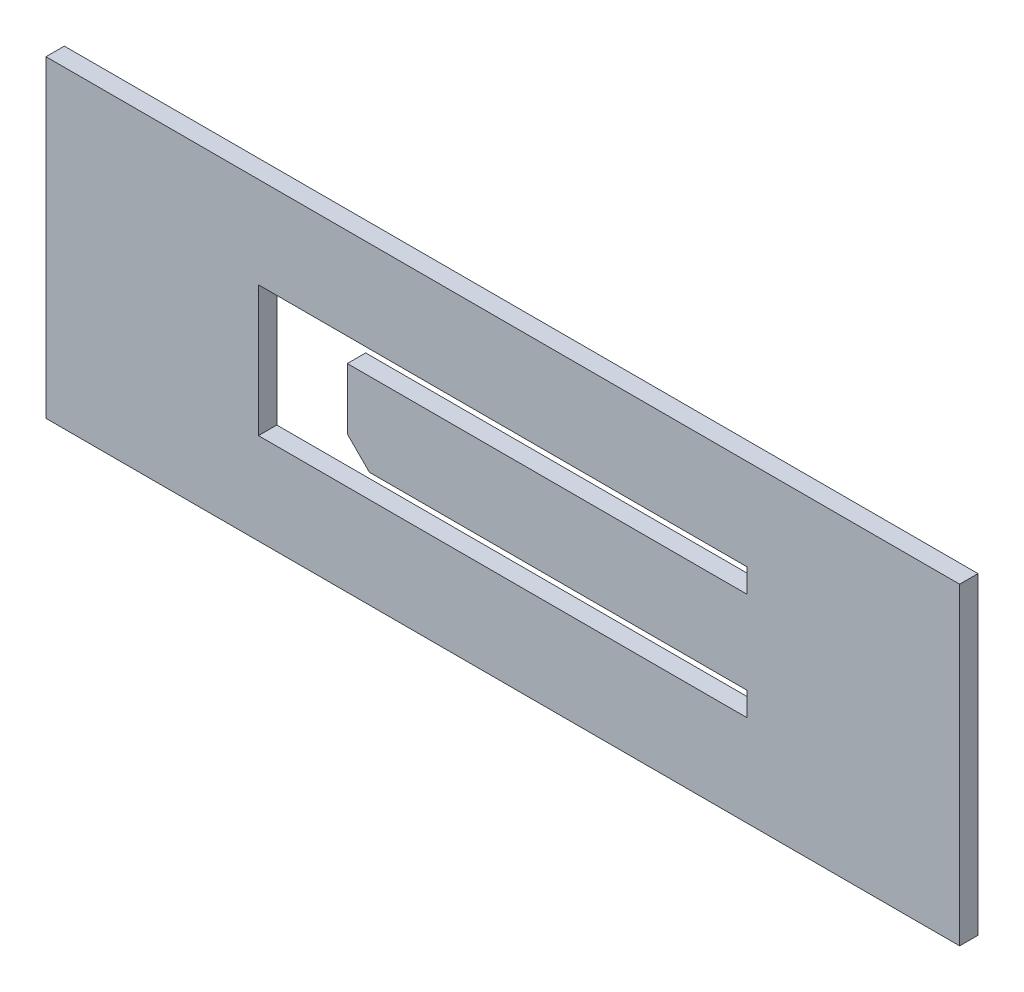
ISO-10303-21;
HEADER;
FILE_DESCRIPTION(('STEP AP214'),'2;1');
FILE_NAME('part.step','',(''),(''),'','','');
FILE_SCHEMA(('AUTOMOTIVE_DESIGN { 1 0 10303 214 1 1 1 1 }'));
ENDSEC;
DATA;
#1=APPLICATION_CONTEXT('core data for automotive mechanical design processes');
#2=APPLICATION_PROTOCOL_DEFINITION('international standard','automotive_design',2000,#1);
#3=PRODUCT_CONTEXT('',#1,'mechanical');
#4=PRODUCT('Part','Part','',(#3));
#5=PRODUCT_RELATED_PRODUCT_CATEGORY('part','',(#4));
#6=PRODUCT_DEFINITION_FORMATION('','',#4);
#7=PRODUCT_DEFINITION_CONTEXT('part definition',#1,'design');
#8=PRODUCT_DEFINITION('design','',#6,#7);
#9=PRODUCT_DEFINITION_SHAPE('','',#8);
#10=(LENGTH_UNIT() NAMED_UNIT(*) SI_UNIT(.MILLI.,.METRE.));
#11=(NAMED_UNIT(*) PLANE_ANGLE_UNIT() SI_UNIT($,.RADIAN.));
#12=(NAMED_UNIT(*) SI_UNIT($,.STERADIAN.) SOLID_ANGLE_UNIT());
#13=UNCERTAINTY_MEASURE_WITH_UNIT(LENGTH_MEASURE(1.E-05),#10,'distance_accuracy_value','');
#14=(GEOMETRIC_REPRESENTATION_CONTEXT(3) GLOBAL_UNCERTAINTY_ASSIGNED_CONTEXT((#13)) GLOBAL_UNIT_ASSIGNED_CONTEXT((#10,
#11,#12)) REPRESENTATION_CONTEXT('',''));
#15=CARTESIAN_POINT('',(0.,0.,0.));
#16=DIRECTION('',(0.,0.,1.));
#17=DIRECTION('',(1.,0.,0.));
#18=AXIS2_PLACEMENT_3D('',#15,#16,#17);
#19=CARTESIAN_POINT('',(74.6378493013972,-25.590119760479,-3.));
#20=DIRECTION('',(1.,0.,0.));
#21=DIRECTION('',(0.,0.,-1.));
#22=AXIS2_PLACEMENT_3D('',#19,#20,#21);
#23=PLANE('',#22);
#24=DIRECTION('',(0.,1.,0.));
#25=VECTOR('',#24,1.);
#26=CARTESIAN_POINT('',(74.6378493013972,-25.590119760479,0.));
#27=LINE('',#26,#25);
#28=CARTESIAN_POINT('',(74.6378493013972,-25.590119760479,0.));
#29=VERTEX_POINT('',#28);
#30=CARTESIAN_POINT('',(74.6378493013972,25.590119760479,0.));
#31=VERTEX_POINT('',#30);
#32=EDGE_CURVE('E196',#29,#31,#27,.T.);
#33=ORIENTED_EDGE('',*,*,#32,.F.);
#34=DIRECTION('',(0.,0.,1.));
#35=VECTOR('',#34,1.);
#36=CARTESIAN_POINT('',(74.6378493013972,-25.590119760479,-3.));
#37=LINE('',#36,#35);
#38=CARTESIAN_POINT('',(74.6378493013972,-25.590119760479,-3.));
#39=VERTEX_POINT('',#38);
#40=EDGE_CURVE('E11',#39,#29,#37,.T.);
#41=ORIENTED_EDGE('',*,*,#40,.F.);
#42=DIRECTION('',(0.,1.,0.));
#43=VECTOR('',#42,1.);
#44=CARTESIAN_POINT('',(74.6378493013972,-25.590119760479,-3.));
#45=LINE('',#44,#43);
#46=CARTESIAN_POINT('',(74.6378493013972,25.590119760479,-3.));
#47=VERTEX_POINT('',#46);
#48=EDGE_CURVE('E210',#39,#47,#45,.T.);
#49=ORIENTED_EDGE('',*,*,#48,.T.);
#50=DIRECTION('',(0.,0.,1.));
#51=VECTOR('',#50,1.);
#52=CARTESIAN_POINT('',(74.6378493013972,25.590119760479,-3.));
#53=LINE('',#52,#51);
#54=EDGE_CURVE('E41',#47,#31,#53,.T.);
#55=ORIENTED_EDGE('',*,*,#54,.T.);
#56=EDGE_LOOP('',(#33,#41,#49,#55));
#57=FACE_BOUND('',#56,.T.);
#58=ADVANCED_FACE('F38',(#57),#23,.T.);
#59=CARTESIAN_POINT('',(74.6378493013972,-25.590119760479,-3.));
#60=DIRECTION('',(0.,-1.,0.));
#61=DIRECTION('',(0.,0.,-1.));
#62=AXIS2_PLACEMENT_3D('',#59,#60,#61);
#63=PLANE('',#62);
#64=DIRECTION('',(1.,0.,0.));
#65=VECTOR('',#64,1.);
#66=CARTESIAN_POINT('',(74.6378493013972,-25.590119760479,0.));
#67=LINE('',#66,#65);
#68=CARTESIAN_POINT('',(-74.6378493013972,-25.590119760479,0.));
#69=VERTEX_POINT('',#68);
#70=EDGE_CURVE('E214',#69,#29,#67,.T.);
#71=ORIENTED_EDGE('',*,*,#70,.F.);
#72=DIRECTION('',(0.,0.,1.));
#73=VECTOR('',#72,1.);
#74=CARTESIAN_POINT('',(-74.6378493013972,-25.590119760479,-3.));
#75=LINE('',#74,#73);
#76=CARTESIAN_POINT('',(-74.6378493013972,-25.590119760479,-3.));
#77=VERTEX_POINT('',#76);
#78=EDGE_CURVE('E46',#77,#69,#75,.T.);
#79=ORIENTED_EDGE('',*,*,#78,.F.);
#80=DIRECTION('',(1.,0.,0.));
#81=VECTOR('',#80,1.);
#82=CARTESIAN_POINT('',(74.6378493013972,-25.590119760479,-3.));
#83=LINE('',#82,#81);
#84=EDGE_CURVE('E220',#77,#39,#83,.T.);
#85=ORIENTED_EDGE('',*,*,#84,.T.);
#86=ORIENTED_EDGE('',*,*,#40,.T.);
#87=EDGE_LOOP('',(#71,#79,#85,#86));
#88=FACE_BOUND('',#87,.T.);
#89=ADVANCED_FACE('F246',(#88),#63,.T.);
#90=CARTESIAN_POINT('',(-74.6378493013972,-25.590119760479,-3.));
#91=DIRECTION('',(-1.,0.,0.));
#92=DIRECTION('',(0.,0.,1.));
#93=AXIS2_PLACEMENT_3D('',#90,#91,#92);
#94=PLANE('',#93);
#95=DIRECTION('',(0.,-1.,0.));
#96=VECTOR('',#95,1.);
#97=CARTESIAN_POINT('',(-74.6378493013972,-25.590119760479,0.));
#98=LINE('',#97,#96);
#99=CARTESIAN_POINT('',(-74.6378493013972,25.590119760479,0.));
#100=VERTEX_POINT('',#99);
#101=EDGE_CURVE('E228',#100,#69,#98,.T.);
#102=ORIENTED_EDGE('',*,*,#101,.F.);
#103=DIRECTION('',(0.,0.,1.));
#104=VECTOR('',#103,1.);
#105=CARTESIAN_POINT('',(-74.6378493013972,25.590119760479,-3.));
#106=LINE('',#105,#104);
#107=CARTESIAN_POINT('',(-74.6378493013972,25.590119760479,-3.));
#108=VERTEX_POINT('',#107);
#109=EDGE_CURVE('E233',#108,#100,#106,.T.);
#110=ORIENTED_EDGE('',*,*,#109,.F.);
#111=DIRECTION('',(0.,-1.,0.));
#112=VECTOR('',#111,1.);
#113=CARTESIAN_POINT('',(-74.6378493013972,-25.590119760479,-3.));
#114=LINE('',#113,#112);
#115=EDGE_CURVE('E217',#108,#77,#114,.T.);
#116=ORIENTED_EDGE('',*,*,#115,.T.);
#117=ORIENTED_EDGE('',*,*,#78,.T.);
#118=EDGE_LOOP('',(#102,#110,#116,#117));
#119=FACE_BOUND('',#118,.T.);
#120=ADVANCED_FACE('F250',(#119),#94,.T.);
#121=CARTESIAN_POINT('',(74.6378493013972,25.590119760479,-3.));
#122=DIRECTION('',(0.,1.,0.));
#123=DIRECTION('',(0.,0.,1.));
#124=AXIS2_PLACEMENT_3D('',#121,#122,#123);
#125=PLANE('',#124);
#126=DIRECTION('',(-1.,0.,0.));
#127=VECTOR('',#126,1.);
#128=CARTESIAN_POINT('',(74.6378493013972,25.590119760479,0.));
#129=LINE('',#128,#127);
#130=EDGE_CURVE('E225',#31,#100,#129,.T.);
#131=ORIENTED_EDGE('',*,*,#130,.F.);
#132=ORIENTED_EDGE('',*,*,#54,.F.);
#133=DIRECTION('',(-1.,0.,0.));
#134=VECTOR('',#133,1.);
#135=CARTESIAN_POINT('',(74.6378493013972,25.590119760479,-3.));
#136=LINE('',#135,#134);
#137=EDGE_CURVE('E213',#47,#108,#136,.T.);
#138=ORIENTED_EDGE('',*,*,#137,.T.);
#139=ORIENTED_EDGE('',*,*,#109,.T.);
#140=EDGE_LOOP('',(#131,#132,#138,#139));
#141=FACE_BOUND('',#140,.T.);
#142=ADVANCED_FACE('F241',(#141),#125,.T.);
#143=CARTESIAN_POINT('',(0.,0.,-3.));
#144=DIRECTION('',(0.,0.,1.));
#145=DIRECTION('',(1.,0.,0.));
#146=AXIS2_PLACEMENT_3D('',#143,#144,#145);
#147=PLANE('',#146);
#148=DIRECTION('',(0.,1.,0.));
#149=VECTOR('',#148,1.);
#150=CARTESIAN_POINT('',(-25.4100806282466,6.79196508268889,-3.));
#151=LINE('',#150,#149);
#152=CARTESIAN_POINT('',(-25.4100806282466,-3.17731175601577,-3.));
#153=VERTEX_POINT('',#152);
#154=CARTESIAN_POINT('',(-25.4100806282466,6.79196508268889,-3.));
#155=VERTEX_POINT('',#154);
#156=EDGE_CURVE('E141',#153,#155,#151,.T.);
#157=ORIENTED_EDGE('',*,*,#156,.T.);
#158=DIRECTION('',(1.,0.,0.));
#159=VECTOR('',#158,1.);
#160=CARTESIAN_POINT('',(39.9264512287923,6.79196508268892,-3.));
#161=LINE('',#160,#159);
#162=CARTESIAN_POINT('',(39.9264512287923,6.79196508268892,-3.));
#163=VERTEX_POINT('',#162);
#164=EDGE_CURVE('E135',#155,#163,#161,.T.);
#165=ORIENTED_EDGE('',*,*,#164,.T.);
#166=DIRECTION('',(0.,1.,0.));
#167=VECTOR('',#166,1.);
#168=CARTESIAN_POINT('',(39.9264512287923,6.79196508268892,-3.));
#169=LINE('',#168,#167);
#170=CARTESIAN_POINT('',(39.9264512287924,10.6721055548399,-3.));
#171=VERTEX_POINT('',#170);
#172=EDGE_CURVE('E144',#163,#171,#169,.T.);
#173=ORIENTED_EDGE('',*,*,#172,.T.);
#174=DIRECTION('',(-1.,0.,0.));
#175=VECTOR('',#174,1.);
#176=CARTESIAN_POINT('',(39.9264512287924,10.6721055548399,-3.));
#177=LINE('',#176,#175);
#178=CARTESIAN_POINT('',(-39.9264512287924,10.6721055548399,-3.));
#179=VERTEX_POINT('',#178);
#180=EDGE_CURVE('E54',#171,#179,#177,.T.);
#181=ORIENTED_EDGE('',*,*,#180,.T.);
#182=DIRECTION('',(0.,-1.,0.));
#183=VECTOR('',#182,1.);
#184=CARTESIAN_POINT('',(-39.9264512287924,-10.6721055548399,-3.));
#185=LINE('',#184,#183);
#186=CARTESIAN_POINT('',(-39.9264512287924,-10.6721055548399,-3.));
#187=VERTEX_POINT('',#186);
#188=EDGE_CURVE('E159',#179,#187,#185,.T.);
#189=ORIENTED_EDGE('',*,*,#188,.T.);
#190=DIRECTION('',(1.,0.,0.));
#191=VECTOR('',#190,1.);
#192=CARTESIAN_POINT('',(39.9264512287924,-10.6721055548399,-3.));
#193=LINE('',#192,#191);
#194=CARTESIAN_POINT('',(39.9264512287924,-10.6721055548399,-3.));
#195=VERTEX_POINT('',#194);
#196=EDGE_CURVE('E162',#187,#195,#193,.T.);
#197=ORIENTED_EDGE('',*,*,#196,.T.);
#198=DIRECTION('',(0.,1.,0.));
#199=VECTOR('',#198,1.);
#200=CARTESIAN_POINT('',(39.9264512287924,-10.6721055548399,-3.));
#201=LINE('',#200,#199);
#202=CARTESIAN_POINT('',(39.9264512287923,-6.79196508268892,-3.));
#203=VERTEX_POINT('',#202);
#204=EDGE_CURVE('E165',#195,#203,#201,.T.);
#205=ORIENTED_EDGE('',*,*,#204,.T.);
#206=DIRECTION('',(-1.,0.,0.));
#207=VECTOR('',#206,1.);
#208=CARTESIAN_POINT('',(39.9264512287923,-6.79196508268892,-3.));
#209=LINE('',#208,#207);
#210=CARTESIAN_POINT('',(-21.7954273015734,-6.79196508268893,-3.));
#211=VERTEX_POINT('',#210);
#212=EDGE_CURVE('E168',#203,#211,#209,.T.);
#213=ORIENTED_EDGE('',*,*,#212,.T.);
#214=DIRECTION('',(-0.707106781186558,0.707106781186537,0.));
#215=VECTOR('',#214,1.);
#216=CARTESIAN_POINT('',(-21.7954273015734,-6.79196508268893,-3.));
#217=LINE('',#216,#215);
#218=EDGE_CURVE('E171',#211,#153,#217,.T.);
#219=ORIENTED_EDGE('',*,*,#218,.T.);
#220=EDGE_LOOP('',(#157,#165,#173,#181,#189,#197,#205,#213,#219));
#221=FACE_BOUND('',#220,.T.);
#222=ORIENTED_EDGE('',*,*,#48,.F.);
#223=ORIENTED_EDGE('',*,*,#84,.F.);
#224=ORIENTED_EDGE('',*,*,#115,.F.);
#225=ORIENTED_EDGE('',*,*,#137,.F.);
#226=EDGE_LOOP('',(#222,#223,#224,#225));
#227=FACE_BOUND('',#226,.T.);
#228=ADVANCED_FACE('F148',(#221,#227),#147,.F.);
#229=CARTESIAN_POINT('',(0.,0.,0.));
#230=DIRECTION('',(0.,0.,1.));
#231=DIRECTION('',(1.,0.,0.));
#232=AXIS2_PLACEMENT_3D('',#229,#230,#231);
#233=PLANE('',#232);
#234=DIRECTION('',(1.,0.,0.));
#235=VECTOR('',#234,1.);
#236=CARTESIAN_POINT('',(39.9264512287923,6.79196508268892,0.));
#237=LINE('',#236,#235);
#238=CARTESIAN_POINT('',(-25.4100806282466,6.79196508268889,0.));
#239=VERTEX_POINT('',#238);
#240=CARTESIAN_POINT('',(39.9264512287923,6.79196508268892,0.));
#241=VERTEX_POINT('',#240);
#242=EDGE_CURVE('E62',#239,#241,#237,.T.);
#243=ORIENTED_EDGE('',*,*,#242,.F.);
#244=DIRECTION('',(0.,1.,0.));
#245=VECTOR('',#244,1.);
#246=CARTESIAN_POINT('',(-25.4100806282466,6.79196508268889,0.));
#247=LINE('',#246,#245);
#248=CARTESIAN_POINT('',(-25.4100806282466,-3.17731175601577,0.));
#249=VERTEX_POINT('',#248);
#250=EDGE_CURVE('E152',#249,#239,#247,.T.);
#251=ORIENTED_EDGE('',*,*,#250,.F.);
#252=DIRECTION('',(-0.707106781186558,0.707106781186537,0.));
#253=VECTOR('',#252,1.);
#254=CARTESIAN_POINT('',(-21.7954273015734,-6.79196508268893,0.));
#255=LINE('',#254,#253);
#256=CARTESIAN_POINT('',(-21.7954273015734,-6.79196508268893,0.));
#257=VERTEX_POINT('',#256);
#258=EDGE_CURVE('E155',#257,#249,#255,.T.);
#259=ORIENTED_EDGE('',*,*,#258,.F.);
#260=DIRECTION('',(-1.,0.,0.));
#261=VECTOR('',#260,1.);
#262=CARTESIAN_POINT('',(39.9264512287923,-6.79196508268892,0.));
#263=LINE('',#262,#261);
#264=CARTESIAN_POINT('',(39.9264512287923,-6.79196508268892,0.));
#265=VERTEX_POINT('',#264);
#266=EDGE_CURVE('E189',#265,#257,#263,.T.);
#267=ORIENTED_EDGE('',*,*,#266,.F.);
#268=DIRECTION('',(0.,1.,0.));
#269=VECTOR('',#268,1.);
#270=CARTESIAN_POINT('',(39.9264512287924,-10.6721055548399,0.));
#271=LINE('',#270,#269);
#272=CARTESIAN_POINT('',(39.9264512287924,-10.6721055548399,0.));
#273=VERTEX_POINT('',#272);
#274=EDGE_CURVE('E186',#273,#265,#271,.T.);
#275=ORIENTED_EDGE('',*,*,#274,.F.);
#276=DIRECTION('',(1.,0.,0.));
#277=VECTOR('',#276,1.);
#278=CARTESIAN_POINT('',(39.9264512287924,-10.6721055548399,0.));
#279=LINE('',#278,#277);
#280=CARTESIAN_POINT('',(-39.9264512287924,-10.6721055548399,0.));
#281=VERTEX_POINT('',#280);
#282=EDGE_CURVE('E183',#281,#273,#279,.T.);
#283=ORIENTED_EDGE('',*,*,#282,.F.);
#284=DIRECTION('',(0.,-1.,0.));
#285=VECTOR('',#284,1.);
#286=CARTESIAN_POINT('',(-39.9264512287924,-10.6721055548399,0.));
#287=LINE('',#286,#285);
#288=CARTESIAN_POINT('',(-39.9264512287924,10.6721055548399,0.));
#289=VERTEX_POINT('',#288);
#290=EDGE_CURVE('E180',#289,#281,#287,.T.);
#291=ORIENTED_EDGE('',*,*,#290,.F.);
#292=DIRECTION('',(-1.,0.,0.));
#293=VECTOR('',#292,1.);
#294=CARTESIAN_POINT('',(39.9264512287924,10.6721055548399,0.));
#295=LINE('',#294,#293);
#296=CARTESIAN_POINT('',(39.9264512287924,10.6721055548399,0.));
#297=VERTEX_POINT('',#296);
#298=EDGE_CURVE('E177',#297,#289,#295,.T.);
#299=ORIENTED_EDGE('',*,*,#298,.F.);
#300=DIRECTION('',(0.,1.,0.));
#301=VECTOR('',#300,1.);
#302=CARTESIAN_POINT('',(39.9264512287923,6.79196508268892,0.));
#303=LINE('',#302,#301);
#304=EDGE_CURVE('E175',#241,#297,#303,.T.);
#305=ORIENTED_EDGE('',*,*,#304,.F.);
#306=EDGE_LOOP('',(#243,#251,#259,#267,#275,#283,#291,#299,#305));
#307=FACE_BOUND('',#306,.T.);
#308=ORIENTED_EDGE('',*,*,#32,.T.);
#309=ORIENTED_EDGE('',*,*,#130,.T.);
#310=ORIENTED_EDGE('',*,*,#101,.T.);
#311=ORIENTED_EDGE('',*,*,#70,.T.);
#312=EDGE_LOOP('',(#308,#309,#310,#311));
#313=FACE_BOUND('',#312,.T.);
#314=ADVANCED_FACE('F243',(#307,#313),#233,.T.);
#315=CARTESIAN_POINT('',(39.9264512287923,6.79196508268892,-3.));
#316=DIRECTION('',(0.,-1.,0.));
#317=DIRECTION('',(1.,0.,0.));
#318=AXIS2_PLACEMENT_3D('',#315,#316,#317);
#319=PLANE('',#318);
#320=ORIENTED_EDGE('',*,*,#242,.T.);
#321=DIRECTION('',(0.,0.,1.));
#322=VECTOR('',#321,1.);
#323=CARTESIAN_POINT('',(39.9264512287923,6.79196508268892,-3.));
#324=LINE('',#323,#322);
#325=EDGE_CURVE('E131',#163,#241,#324,.T.);
#326=ORIENTED_EDGE('',*,*,#325,.F.);
#327=ORIENTED_EDGE('',*,*,#164,.F.);
#328=DIRECTION('',(0.,0.,1.));
#329=VECTOR('',#328,1.);
#330=CARTESIAN_POINT('',(-25.4100806282466,6.79196508268889,-3.));
#331=LINE('',#330,#329);
#332=EDGE_CURVE('E194',#155,#239,#331,.T.);
#333=ORIENTED_EDGE('',*,*,#332,.T.);
#334=EDGE_LOOP('',(#320,#326,#327,#333));
#335=FACE_BOUND('',#334,.T.);
#336=ADVANCED_FACE('F133',(#335),#319,.F.);
#337=CARTESIAN_POINT('',(-25.4100806282466,6.79196508268889,-3.));
#338=DIRECTION('',(1.,0.,0.));
#339=DIRECTION('',(0.,0.,-1.));
#340=AXIS2_PLACEMENT_3D('',#337,#338,#339);
#341=PLANE('',#340);
#342=ORIENTED_EDGE('',*,*,#250,.T.);
#343=ORIENTED_EDGE('',*,*,#332,.F.);
#344=ORIENTED_EDGE('',*,*,#156,.F.);
#345=DIRECTION('',(0.,0.,1.));
#346=VECTOR('',#345,1.);
#347=CARTESIAN_POINT('',(-25.4100806282466,-3.17731175601577,-3.));
#348=LINE('',#347,#346);
#349=EDGE_CURVE('E197',#153,#249,#348,.T.);
#350=ORIENTED_EDGE('',*,*,#349,.T.);
#351=EDGE_LOOP('',(#342,#343,#344,#350));
#352=FACE_BOUND('',#351,.T.);
#353=ADVANCED_FACE('F306',(#352),#341,.F.);
#354=CARTESIAN_POINT('',(-21.7954273015734,-6.79196508268893,-3.));
#355=DIRECTION('',(0.707106781186537,0.707106781186558,0.));
#356=DIRECTION('',(-0.707106781186558,0.707106781186537,0.));
#357=AXIS2_PLACEMENT_3D('',#354,#355,#356);
#358=PLANE('',#357);
#359=ORIENTED_EDGE('',*,*,#258,.T.);
#360=ORIENTED_EDGE('',*,*,#349,.F.);
#361=ORIENTED_EDGE('',*,*,#218,.F.);
#362=DIRECTION('',(0.,0.,1.));
#363=VECTOR('',#362,1.);
#364=CARTESIAN_POINT('',(-21.7954273015734,-6.79196508268893,-3.));
#365=LINE('',#364,#363);
#366=EDGE_CURVE('E199',#211,#257,#365,.T.);
#367=ORIENTED_EDGE('',*,*,#366,.T.);
#368=EDGE_LOOP('',(#359,#360,#361,#367));
#369=FACE_BOUND('',#368,.T.);
#370=ADVANCED_FACE('F316',(#369),#358,.F.);
#371=CARTESIAN_POINT('',(39.9264512287923,-6.79196508268892,-3.));
#372=DIRECTION('',(0.,1.,0.));
#373=DIRECTION('',(-1.,0.,0.));
#374=AXIS2_PLACEMENT_3D('',#371,#372,#373);
#375=PLANE('',#374);
#376=ORIENTED_EDGE('',*,*,#266,.T.);
#377=ORIENTED_EDGE('',*,*,#366,.F.);
#378=ORIENTED_EDGE('',*,*,#212,.F.);
#379=DIRECTION('',(0.,0.,1.));
#380=VECTOR('',#379,1.);
#381=CARTESIAN_POINT('',(39.9264512287923,-6.79196508268892,-3.));
#382=LINE('',#381,#380);
#383=EDGE_CURVE('E201',#203,#265,#382,.T.);
#384=ORIENTED_EDGE('',*,*,#383,.T.);
#385=EDGE_LOOP('',(#376,#377,#378,#384));
#386=FACE_BOUND('',#385,.T.);
#387=ADVANCED_FACE('F327',(#386),#375,.F.);
#388=CARTESIAN_POINT('',(39.9264512287924,-10.6721055548399,-3.));
#389=DIRECTION('',(1.,0.,0.));
#390=DIRECTION('',(0.,1.,0.));
#391=AXIS2_PLACEMENT_3D('',#388,#389,#390);
#392=PLANE('',#391);
#393=ORIENTED_EDGE('',*,*,#274,.T.);
#394=ORIENTED_EDGE('',*,*,#383,.F.);
#395=ORIENTED_EDGE('',*,*,#204,.F.);
#396=DIRECTION('',(0.,0.,1.));
#397=VECTOR('',#396,1.);
#398=CARTESIAN_POINT('',(39.9264512287924,-10.6721055548399,-3.));
#399=LINE('',#398,#397);
#400=EDGE_CURVE('E203',#195,#273,#399,.T.);
#401=ORIENTED_EDGE('',*,*,#400,.T.);
#402=EDGE_LOOP('',(#393,#394,#395,#401));
#403=FACE_BOUND('',#402,.T.);
#404=ADVANCED_FACE('F338',(#403),#392,.F.);
#405=CARTESIAN_POINT('',(39.9264512287924,-10.6721055548399,-3.));
#406=DIRECTION('',(0.,-1.,0.));
#407=DIRECTION('',(0.,0.,-1.));
#408=AXIS2_PLACEMENT_3D('',#405,#406,#407);
#409=PLANE('',#408);
#410=ORIENTED_EDGE('',*,*,#282,.T.);
#411=ORIENTED_EDGE('',*,*,#400,.F.);
#412=ORIENTED_EDGE('',*,*,#196,.F.);
#413=DIRECTION('',(0.,0.,1.));
#414=VECTOR('',#413,1.);
#415=CARTESIAN_POINT('',(-39.9264512287924,-10.6721055548399,-3.));
#416=LINE('',#415,#414);
#417=EDGE_CURVE('E205',#187,#281,#416,.T.);
#418=ORIENTED_EDGE('',*,*,#417,.T.);
#419=EDGE_LOOP('',(#410,#411,#412,#418));
#420=FACE_BOUND('',#419,.T.);
#421=ADVANCED_FACE('F349',(#420),#409,.F.);
#422=CARTESIAN_POINT('',(-39.9264512287924,-10.6721055548399,-3.));
#423=DIRECTION('',(-1.,0.,0.));
#424=DIRECTION('',(0.,0.,1.));
#425=AXIS2_PLACEMENT_3D('',#422,#423,#424);
#426=PLANE('',#425);
#427=ORIENTED_EDGE('',*,*,#290,.T.);
#428=ORIENTED_EDGE('',*,*,#417,.F.);
#429=ORIENTED_EDGE('',*,*,#188,.F.);
#430=DIRECTION('',(0.,0.,1.));
#431=VECTOR('',#430,1.);
#432=CARTESIAN_POINT('',(-39.9264512287924,10.6721055548399,-3.));
#433=LINE('',#432,#431);
#434=EDGE_CURVE('E207',#179,#289,#433,.T.);
#435=ORIENTED_EDGE('',*,*,#434,.T.);
#436=EDGE_LOOP('',(#427,#428,#429,#435));
#437=FACE_BOUND('',#436,.T.);
#438=ADVANCED_FACE('F360',(#437),#426,.F.);
#439=CARTESIAN_POINT('',(39.9264512287924,10.6721055548399,-3.));
#440=DIRECTION('',(0.,1.,0.));
#441=DIRECTION('',(0.,0.,1.));
#442=AXIS2_PLACEMENT_3D('',#439,#440,#441);
#443=PLANE('',#442);
#444=ORIENTED_EDGE('',*,*,#298,.T.);
#445=ORIENTED_EDGE('',*,*,#434,.F.);
#446=ORIENTED_EDGE('',*,*,#180,.F.);
#447=DIRECTION('',(0.,0.,1.));
#448=VECTOR('',#447,1.);
#449=CARTESIAN_POINT('',(39.9264512287924,10.6721055548399,-3.));
#450=LINE('',#449,#448);
#451=EDGE_CURVE('E140',#171,#297,#450,.T.);
#452=ORIENTED_EDGE('',*,*,#451,.T.);
#453=EDGE_LOOP('',(#444,#445,#446,#452));
#454=FACE_BOUND('',#453,.T.);
#455=ADVANCED_FACE('F371',(#454),#443,.F.);
#456=CARTESIAN_POINT('',(39.9264512287923,6.79196508268892,-3.));
#457=DIRECTION('',(1.,0.,0.));
#458=DIRECTION('',(0.,1.,0.));
#459=AXIS2_PLACEMENT_3D('',#456,#457,#458);
#460=PLANE('',#459);
#461=ORIENTED_EDGE('',*,*,#304,.T.);
#462=ORIENTED_EDGE('',*,*,#451,.F.);
#463=ORIENTED_EDGE('',*,*,#172,.F.);
#464=ORIENTED_EDGE('',*,*,#325,.T.);
#465=EDGE_LOOP('',(#461,#462,#463,#464));
#466=FACE_BOUND('',#465,.T.);
#467=ADVANCED_FACE('F145',(#466),#460,.F.);
#468=CLOSED_SHELL('',(#58,#89,#120,#142,#228,#314,#336,#353,#370,#387,#404,#421,#438,#455,#467));
#469=MANIFOLD_SOLID_BREP('B2',#468);
#470=ADVANCED_BREP_SHAPE_REPRESENTATION('',(#18,#469),#14);
#471=SHAPE_DEFINITION_REPRESENTATION(#9,#470);
ENDSEC;
END-ISO-10303-21;
